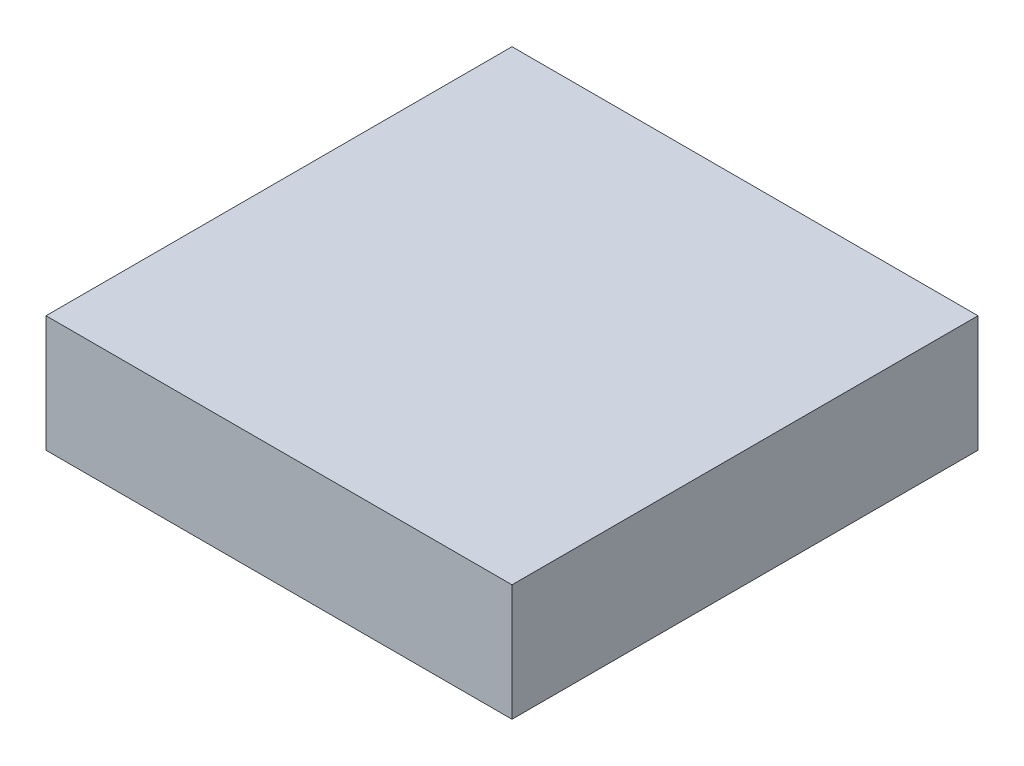
ISO-10303-21;
HEADER;
FILE_DESCRIPTION(('STEP AP214'),'2;1');
FILE_NAME('part.step','',(''),(''),'','','');
FILE_SCHEMA(('AUTOMOTIVE_DESIGN { 1 0 10303 214 1 1 1 1 }'));
ENDSEC;
DATA;
#1=APPLICATION_CONTEXT('core data for automotive mechanical design processes');
#2=APPLICATION_PROTOCOL_DEFINITION('international standard','automotive_design',2000,#1);
#3=PRODUCT_CONTEXT('',#1,'mechanical');
#4=PRODUCT('Part','Part','',(#3));
#5=PRODUCT_RELATED_PRODUCT_CATEGORY('part','',(#4));
#6=PRODUCT_DEFINITION_FORMATION('','',#4);
#7=PRODUCT_DEFINITION_CONTEXT('part definition',#1,'design');
#8=PRODUCT_DEFINITION('design','',#6,#7);
#9=PRODUCT_DEFINITION_SHAPE('','',#8);
#10=(LENGTH_UNIT() NAMED_UNIT(*) SI_UNIT(.MILLI.,.METRE.));
#11=(NAMED_UNIT(*) PLANE_ANGLE_UNIT() SI_UNIT($,.RADIAN.));
#12=(NAMED_UNIT(*) SI_UNIT($,.STERADIAN.) SOLID_ANGLE_UNIT());
#13=UNCERTAINTY_MEASURE_WITH_UNIT(LENGTH_MEASURE(1.E-05),#10,'distance_accuracy_value','');
#14=(GEOMETRIC_REPRESENTATION_CONTEXT(3) GLOBAL_UNCERTAINTY_ASSIGNED_CONTEXT((#13)) GLOBAL_UNIT_ASSIGNED_CONTEXT((#10,
#11,#12)) REPRESENTATION_CONTEXT('',''));
#15=CARTESIAN_POINT('',(0.,0.,0.));
#16=DIRECTION('',(0.,0.,1.));
#17=DIRECTION('',(1.,0.,0.));
#18=AXIS2_PLACEMENT_3D('',#15,#16,#17);
#19=CARTESIAN_POINT('',(0.,15.,0.));
#20=DIRECTION('',(-1.,0.,0.));
#21=DIRECTION('',(0.,0.,1.));
#22=AXIS2_PLACEMENT_3D('',#19,#20,#21);
#23=PLANE('',#22);
#24=DIRECTION('',(0.,0.,-1.));
#25=VECTOR('',#24,1.);
#26=CARTESIAN_POINT('',(0.,0.,0.));
#27=LINE('',#26,#25);
#28=CARTESIAN_POINT('',(0.,0.,0.));
#29=VERTEX_POINT('',#28);
#30=CARTESIAN_POINT('',(0.,0.,-60.));
#31=VERTEX_POINT('',#30);
#32=EDGE_CURVE('E98',#29,#31,#27,.T.);
#33=ORIENTED_EDGE('',*,*,#32,.F.);
#34=DIRECTION('',(0.,-1.,0.));
#35=VECTOR('',#34,1.);
#36=CARTESIAN_POINT('',(0.,15.,0.));
#37=LINE('',#36,#35);
#38=CARTESIAN_POINT('',(0.,15.,0.));
#39=VERTEX_POINT('',#38);
#40=EDGE_CURVE('E11',#39,#29,#37,.T.);
#41=ORIENTED_EDGE('',*,*,#40,.F.);
#42=DIRECTION('',(0.,0.,-1.));
#43=VECTOR('',#42,1.);
#44=CARTESIAN_POINT('',(0.,15.,0.));
#45=LINE('',#44,#43);
#46=CARTESIAN_POINT('',(0.,15.,-60.));
#47=VERTEX_POINT('',#46);
#48=EDGE_CURVE('E93',#39,#47,#45,.T.);
#49=ORIENTED_EDGE('',*,*,#48,.T.);
#50=DIRECTION('',(0.,-1.,0.));
#51=VECTOR('',#50,1.);
#52=CARTESIAN_POINT('',(0.,15.,-60.));
#53=LINE('',#52,#51);
#54=EDGE_CURVE('E36',#47,#31,#53,.T.);
#55=ORIENTED_EDGE('',*,*,#54,.T.);
#56=EDGE_LOOP('',(#33,#41,#49,#55));
#57=FACE_BOUND('',#56,.T.);
#58=ADVANCED_FACE('F33',(#57),#23,.T.);
#59=CARTESIAN_POINT('',(0.,15.,0.));
#60=DIRECTION('',(0.,0.,-1.));
#61=DIRECTION('',(-1.,0.,0.));
#62=AXIS2_PLACEMENT_3D('',#59,#60,#61);
#63=PLANE('',#62);
#64=DIRECTION('',(1.,0.,0.));
#65=VECTOR('',#64,1.);
#66=CARTESIAN_POINT('',(0.,0.,0.));
#67=LINE('',#66,#65);
#68=CARTESIAN_POINT('',(60.,0.,0.));
#69=VERTEX_POINT('',#68);
#70=EDGE_CURVE('E66',#29,#69,#67,.T.);
#71=ORIENTED_EDGE('',*,*,#70,.T.);
#72=DIRECTION('',(0.,-1.,0.));
#73=VECTOR('',#72,1.);
#74=CARTESIAN_POINT('',(60.,15.,0.));
#75=LINE('',#74,#73);
#76=CARTESIAN_POINT('',(60.,15.,0.));
#77=VERTEX_POINT('',#76);
#78=EDGE_CURVE('E42',#77,#69,#75,.T.);
#79=ORIENTED_EDGE('',*,*,#78,.F.);
#80=DIRECTION('',(1.,0.,0.));
#81=VECTOR('',#80,1.);
#82=CARTESIAN_POINT('',(0.,15.,0.));
#83=LINE('',#82,#81);
#84=EDGE_CURVE('E83',#39,#77,#83,.T.);
#85=ORIENTED_EDGE('',*,*,#84,.F.);
#86=ORIENTED_EDGE('',*,*,#40,.T.);
#87=EDGE_LOOP('',(#71,#79,#85,#86));
#88=FACE_BOUND('',#87,.T.);
#89=ADVANCED_FACE('F108',(#88),#63,.F.);
#90=CARTESIAN_POINT('',(60.,15.,0.));
#91=DIRECTION('',(-1.,0.,0.));
#92=DIRECTION('',(0.,0.,1.));
#93=AXIS2_PLACEMENT_3D('',#90,#91,#92);
#94=PLANE('',#93);
#95=DIRECTION('',(0.,0.,-1.));
#96=VECTOR('',#95,1.);
#97=CARTESIAN_POINT('',(60.,0.,0.));
#98=LINE('',#97,#96);
#99=CARTESIAN_POINT('',(60.,0.,-60.));
#100=VERTEX_POINT('',#99);
#101=EDGE_CURVE('E90',#69,#100,#98,.T.);
#102=ORIENTED_EDGE('',*,*,#101,.T.);
#103=DIRECTION('',(0.,-1.,0.));
#104=VECTOR('',#103,1.);
#105=CARTESIAN_POINT('',(60.,15.,-60.));
#106=LINE('',#105,#104);
#107=CARTESIAN_POINT('',(60.,15.,-60.));
#108=VERTEX_POINT('',#107);
#109=EDGE_CURVE('E87',#108,#100,#106,.T.);
#110=ORIENTED_EDGE('',*,*,#109,.F.);
#111=DIRECTION('',(0.,0.,-1.));
#112=VECTOR('',#111,1.);
#113=CARTESIAN_POINT('',(60.,15.,0.));
#114=LINE('',#113,#112);
#115=EDGE_CURVE('E78',#77,#108,#114,.T.);
#116=ORIENTED_EDGE('',*,*,#115,.F.);
#117=ORIENTED_EDGE('',*,*,#78,.T.);
#118=EDGE_LOOP('',(#102,#110,#116,#117));
#119=FACE_BOUND('',#118,.T.);
#120=ADVANCED_FACE('F88',(#119),#94,.F.);
#121=CARTESIAN_POINT('',(0.,15.,-60.));
#122=DIRECTION('',(0.,0.,-1.));
#123=DIRECTION('',(-1.,0.,0.));
#124=AXIS2_PLACEMENT_3D('',#121,#122,#123);
#125=PLANE('',#124);
#126=DIRECTION('',(1.,0.,0.));
#127=VECTOR('',#126,1.);
#128=CARTESIAN_POINT('',(0.,0.,-60.));
#129=LINE('',#128,#127);
#130=EDGE_CURVE('E101',#31,#100,#129,.T.);
#131=ORIENTED_EDGE('',*,*,#130,.F.);
#132=ORIENTED_EDGE('',*,*,#54,.F.);
#133=DIRECTION('',(1.,0.,0.));
#134=VECTOR('',#133,1.);
#135=CARTESIAN_POINT('',(0.,15.,-60.));
#136=LINE('',#135,#134);
#137=EDGE_CURVE('E82',#47,#108,#136,.T.);
#138=ORIENTED_EDGE('',*,*,#137,.T.);
#139=ORIENTED_EDGE('',*,*,#109,.T.);
#140=EDGE_LOOP('',(#131,#132,#138,#139));
#141=FACE_BOUND('',#140,.T.);
#142=ADVANCED_FACE('F92',(#141),#125,.T.);
#143=CARTESIAN_POINT('',(0.,15.,0.));
#144=DIRECTION('',(0.,-1.,0.));
#145=DIRECTION('',(0.,0.,-1.));
#146=AXIS2_PLACEMENT_3D('',#143,#144,#145);
#147=PLANE('',#146);
#148=ORIENTED_EDGE('',*,*,#48,.F.);
#149=ORIENTED_EDGE('',*,*,#84,.T.);
#150=ORIENTED_EDGE('',*,*,#115,.T.);
#151=ORIENTED_EDGE('',*,*,#137,.F.);
#152=EDGE_LOOP('',(#148,#149,#150,#151));
#153=FACE_BOUND('',#152,.T.);
#154=ADVANCED_FACE('F81',(#153),#147,.F.);
#155=CARTESIAN_POINT('',(0.,0.,0.));
#156=DIRECTION('',(0.,-1.,0.));
#157=DIRECTION('',(0.,0.,-1.));
#158=AXIS2_PLACEMENT_3D('',#155,#156,#157);
#159=PLANE('',#158);
#160=ORIENTED_EDGE('',*,*,#32,.T.);
#161=ORIENTED_EDGE('',*,*,#130,.T.);
#162=ORIENTED_EDGE('',*,*,#101,.F.);
#163=ORIENTED_EDGE('',*,*,#70,.F.);
#164=EDGE_LOOP('',(#160,#161,#162,#163));
#165=FACE_BOUND('',#164,.T.);
#166=ADVANCED_FACE('F106',(#165),#159,.T.);
#167=CLOSED_SHELL('',(#58,#89,#120,#142,#154,#166));
#168=MANIFOLD_SOLID_BREP('B2',#167);
#169=ADVANCED_BREP_SHAPE_REPRESENTATION('',(#18,#168),#14);
#170=SHAPE_DEFINITION_REPRESENTATION(#9,#169);
ENDSEC;
END-ISO-10303-21;
